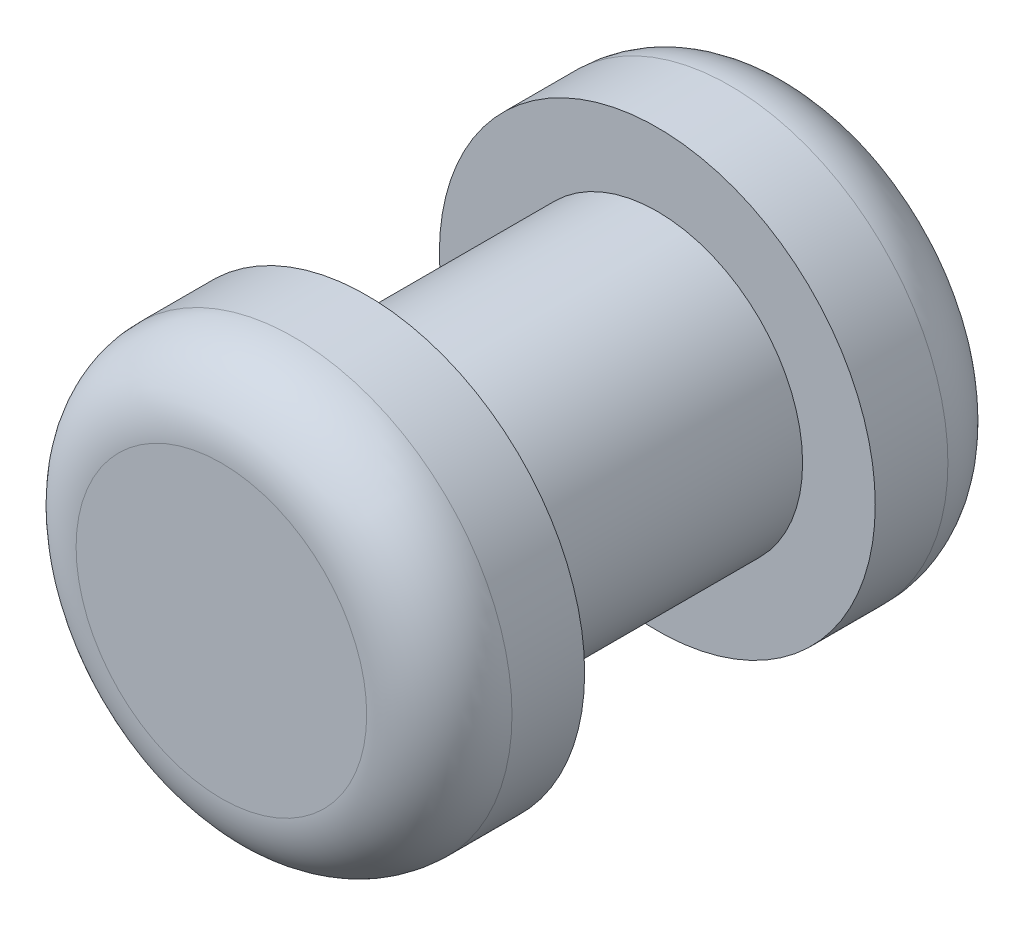
ISO-10303-21;
HEADER;
FILE_DESCRIPTION(('STEP AP214'),'2;1');
FILE_NAME('part.step','',(''),(''),'','','');
FILE_SCHEMA(('AUTOMOTIVE_DESIGN { 1 0 10303 214 1 1 1 1 }'));
ENDSEC;
DATA;
#1=APPLICATION_CONTEXT('core data for automotive mechanical design processes');
#2=APPLICATION_PROTOCOL_DEFINITION('international standard','automotive_design',2000,#1);
#3=PRODUCT_CONTEXT('',#1,'mechanical');
#4=PRODUCT('Part','Part','',(#3));
#5=PRODUCT_RELATED_PRODUCT_CATEGORY('part','',(#4));
#6=PRODUCT_DEFINITION_FORMATION('','',#4);
#7=PRODUCT_DEFINITION_CONTEXT('part definition',#1,'design');
#8=PRODUCT_DEFINITION('design','',#6,#7);
#9=PRODUCT_DEFINITION_SHAPE('','',#8);
#10=(LENGTH_UNIT() NAMED_UNIT(*) SI_UNIT(.MILLI.,.METRE.));
#11=(NAMED_UNIT(*) PLANE_ANGLE_UNIT() SI_UNIT($,.RADIAN.));
#12=(NAMED_UNIT(*) SI_UNIT($,.STERADIAN.) SOLID_ANGLE_UNIT());
#13=UNCERTAINTY_MEASURE_WITH_UNIT(LENGTH_MEASURE(1.E-05),#10,'distance_accuracy_value','');
#14=(GEOMETRIC_REPRESENTATION_CONTEXT(3) GLOBAL_UNCERTAINTY_ASSIGNED_CONTEXT((#13)) GLOBAL_UNIT_ASSIGNED_CONTEXT((#10,
#11,#12)) REPRESENTATION_CONTEXT('',''));
#15=CARTESIAN_POINT('',(0.,0.,0.));
#16=DIRECTION('',(0.,0.,1.));
#17=DIRECTION('',(1.,0.,0.));
#18=AXIS2_PLACEMENT_3D('',#15,#16,#17);
#19=CARTESIAN_POINT('',(0.,0.,1.));
#20=DIRECTION('',(0.,0.,1.));
#21=DIRECTION('',(1.,0.,0.));
#22=AXIS2_PLACEMENT_3D('',#19,#20,#21);
#23=PLANE('',#22);
#24=CARTESIAN_POINT('',(0.,0.,1.));
#25=DIRECTION('',(0.,0.,1.));
#26=DIRECTION('',(1.,0.,0.));
#27=AXIS2_PLACEMENT_3D('',#24,#25,#26);
#28=CIRCLE('',#27,0.5);
#29=CARTESIAN_POINT('',(0.5,0.,1.));
#30=VERTEX_POINT('',#29);
#31=EDGE_CURVE('E10',#30,#30,#28,.T.);
#32=ORIENTED_EDGE('',*,*,#31,.T.);
#33=EDGE_LOOP('',(#32));
#34=FACE_BOUND('',#33,.T.);
#35=ADVANCED_FACE('F41',(#34),#23,.T.);
#36=CARTESIAN_POINT('',(0.,0.,0.));
#37=DIRECTION('',(0.,0.,-1.));
#38=DIRECTION('',(-1.,0.,0.));
#39=AXIS2_PLACEMENT_3D('',#36,#37,#38);
#40=CYLINDRICAL_SURFACE('',#39,0.75);
#41=CARTESIAN_POINT('',(0.,0.,0.75));
#42=DIRECTION('',(0.,0.,1.));
#43=DIRECTION('',(1.,0.,0.));
#44=AXIS2_PLACEMENT_3D('',#41,#42,#43);
#45=CIRCLE('',#44,0.75);
#46=CARTESIAN_POINT('',(0.75,0.,0.75));
#47=VERTEX_POINT('',#46);
#48=EDGE_CURVE('E49',#47,#47,#45,.F.);
#49=ORIENTED_EDGE('',*,*,#48,.T.);
#50=EDGE_LOOP('',(#49));
#51=FACE_BOUND('',#50,.T.);
#52=CARTESIAN_POINT('',(0.,0.,0.5));
#53=DIRECTION('',(0.,0.,-1.));
#54=DIRECTION('',(-1.,0.,0.));
#55=AXIS2_PLACEMENT_3D('',#52,#53,#54);
#56=CIRCLE('',#55,0.75);
#57=CARTESIAN_POINT('',(-0.75,0.,0.5));
#58=VERTEX_POINT('',#57);
#59=EDGE_CURVE('E65',#58,#58,#56,.T.);
#60=ORIENTED_EDGE('',*,*,#59,.F.);
#61=EDGE_LOOP('',(#60));
#62=FACE_BOUND('',#61,.T.);
#63=ADVANCED_FACE('F100',(#51,#62),#40,.T.);
#64=CARTESIAN_POINT('',(0.,0.75,0.5));
#65=DIRECTION('',(0.,0.,-1.));
#66=DIRECTION('',(-1.,0.,0.));
#67=AXIS2_PLACEMENT_3D('',#64,#65,#66);
#68=PLANE('',#67);
#69=ORIENTED_EDGE('',*,*,#59,.T.);
#70=EDGE_LOOP('',(#69));
#71=FACE_BOUND('',#70,.T.);
#72=CARTESIAN_POINT('',(0.,0.,0.5));
#73=DIRECTION('',(0.,0.,-1.));
#74=DIRECTION('',(-1.,0.,0.));
#75=AXIS2_PLACEMENT_3D('',#72,#73,#74);
#76=CIRCLE('',#75,0.5);
#77=CARTESIAN_POINT('',(-0.5,0.,0.5));
#78=VERTEX_POINT('',#77);
#79=EDGE_CURVE('E69',#78,#78,#76,.T.);
#80=ORIENTED_EDGE('',*,*,#79,.F.);
#81=EDGE_LOOP('',(#80));
#82=FACE_BOUND('',#81,.T.);
#83=ADVANCED_FACE('F96',(#71,#82),#68,.T.);
#84=CARTESIAN_POINT('',(0.,0.,0.));
#85=DIRECTION('',(0.,0.,-1.));
#86=DIRECTION('',(-1.,0.,0.));
#87=AXIS2_PLACEMENT_3D('',#84,#85,#86);
#88=CYLINDRICAL_SURFACE('',#87,0.5);
#89=ORIENTED_EDGE('',*,*,#79,.T.);
#90=EDGE_LOOP('',(#89));
#91=FACE_BOUND('',#90,.T.);
#92=CARTESIAN_POINT('',(0.,0.,-0.5));
#93=DIRECTION('',(0.,0.,-1.));
#94=DIRECTION('',(-1.,0.,0.));
#95=AXIS2_PLACEMENT_3D('',#92,#93,#94);
#96=CIRCLE('',#95,0.5);
#97=CARTESIAN_POINT('',(-0.5,0.,-0.5));
#98=VERTEX_POINT('',#97);
#99=EDGE_CURVE('E73',#98,#98,#96,.T.);
#100=ORIENTED_EDGE('',*,*,#99,.F.);
#101=EDGE_LOOP('',(#100));
#102=FACE_BOUND('',#101,.T.);
#103=ADVANCED_FACE('F86',(#91,#102),#88,.T.);
#104=CARTESIAN_POINT('',(0.,0.5,-0.5));
#105=DIRECTION('',(0.,0.,1.));
#106=DIRECTION('',(1.,0.,0.));
#107=AXIS2_PLACEMENT_3D('',#104,#105,#106);
#108=PLANE('',#107);
#109=ORIENTED_EDGE('',*,*,#99,.T.);
#110=EDGE_LOOP('',(#109));
#111=FACE_BOUND('',#110,.T.);
#112=CARTESIAN_POINT('',(0.,0.,-0.5));
#113=DIRECTION('',(0.,0.,-1.));
#114=DIRECTION('',(-1.,0.,0.));
#115=AXIS2_PLACEMENT_3D('',#112,#113,#114);
#116=CIRCLE('',#115,0.75);
#117=CARTESIAN_POINT('',(-0.75,0.,-0.5));
#118=VERTEX_POINT('',#117);
#119=EDGE_CURVE('E77',#118,#118,#116,.T.);
#120=ORIENTED_EDGE('',*,*,#119,.F.);
#121=EDGE_LOOP('',(#120));
#122=FACE_BOUND('',#121,.T.);
#123=ADVANCED_FACE('F84',(#111,#122),#108,.T.);
#124=CARTESIAN_POINT('',(0.,0.,0.));
#125=DIRECTION('',(0.,0.,-1.));
#126=DIRECTION('',(-1.,0.,0.));
#127=AXIS2_PLACEMENT_3D('',#124,#125,#126);
#128=CYLINDRICAL_SURFACE('',#127,0.75);
#129=CARTESIAN_POINT('',(0.,0.,-0.75));
#130=DIRECTION('',(0.,0.,-1.));
#131=DIRECTION('',(-1.,0.,0.));
#132=AXIS2_PLACEMENT_3D('',#129,#130,#131);
#133=CIRCLE('',#132,0.75);
#134=CARTESIAN_POINT('',(-0.75,0.,-0.75));
#135=VERTEX_POINT('',#134);
#136=EDGE_CURVE('E54',#135,#135,#133,.F.);
#137=ORIENTED_EDGE('',*,*,#136,.T.);
#138=EDGE_LOOP('',(#137));
#139=FACE_BOUND('',#138,.T.);
#140=ORIENTED_EDGE('',*,*,#119,.T.);
#141=EDGE_LOOP('',(#140));
#142=FACE_BOUND('',#141,.T.);
#143=ADVANCED_FACE('F82',(#139,#142),#128,.T.);
#144=CARTESIAN_POINT('',(0.,0.75,-1.));
#145=DIRECTION('',(0.,0.,-1.));
#146=DIRECTION('',(-1.,0.,0.));
#147=AXIS2_PLACEMENT_3D('',#144,#145,#146);
#148=PLANE('',#147);
#149=CARTESIAN_POINT('',(0.,0.,-1.));
#150=DIRECTION('',(0.,0.,-1.));
#151=DIRECTION('',(-1.,0.,0.));
#152=AXIS2_PLACEMENT_3D('',#149,#150,#151);
#153=CIRCLE('',#152,0.5);
#154=CARTESIAN_POINT('',(-0.5,0.,-1.));
#155=VERTEX_POINT('',#154);
#156=EDGE_CURVE('E59',#155,#155,#153,.T.);
#157=ORIENTED_EDGE('',*,*,#156,.T.);
#158=EDGE_LOOP('',(#157));
#159=FACE_BOUND('',#158,.T.);
#160=ADVANCED_FACE('F93',(#159),#148,.T.);
#161=CARTESIAN_POINT('',(0.,0.,-0.75));
#162=DIRECTION('',(0.,0.,-1.));
#163=DIRECTION('',(-1.,0.,0.));
#164=AXIS2_PLACEMENT_3D('',#161,#162,#163);
#165=TOROIDAL_SURFACE('',#164,0.5,0.25);
#166=ORIENTED_EDGE('',*,*,#136,.F.);
#167=EDGE_LOOP('',(#166));
#168=FACE_BOUND('',#167,.T.);
#169=ORIENTED_EDGE('',*,*,#156,.F.);
#170=EDGE_LOOP('',(#169));
#171=FACE_BOUND('',#170,.T.);
#172=ADVANCED_FACE('F107',(#168,#171),#165,.T.);
#173=CARTESIAN_POINT('',(0.,0.,0.75));
#174=DIRECTION('',(0.,0.,1.));
#175=DIRECTION('',(1.,0.,0.));
#176=AXIS2_PLACEMENT_3D('',#173,#174,#175);
#177=TOROIDAL_SURFACE('',#176,0.5,0.25);
#178=ORIENTED_EDGE('',*,*,#31,.F.);
#179=EDGE_LOOP('',(#178));
#180=FACE_BOUND('',#179,.T.);
#181=ORIENTED_EDGE('',*,*,#48,.F.);
#182=EDGE_LOOP('',(#181));
#183=FACE_BOUND('',#182,.T.);
#184=ADVANCED_FACE('F43',(#180,#183),#177,.T.);
#185=CLOSED_SHELL('',(#35,#63,#83,#103,#123,#143,#160,#172,#184));
#186=MANIFOLD_SOLID_BREP('B2',#185);
#187=ADVANCED_BREP_SHAPE_REPRESENTATION('',(#18,#186),#14);
#188=SHAPE_DEFINITION_REPRESENTATION(#9,#187);
ENDSEC;
END-ISO-10303-21;
